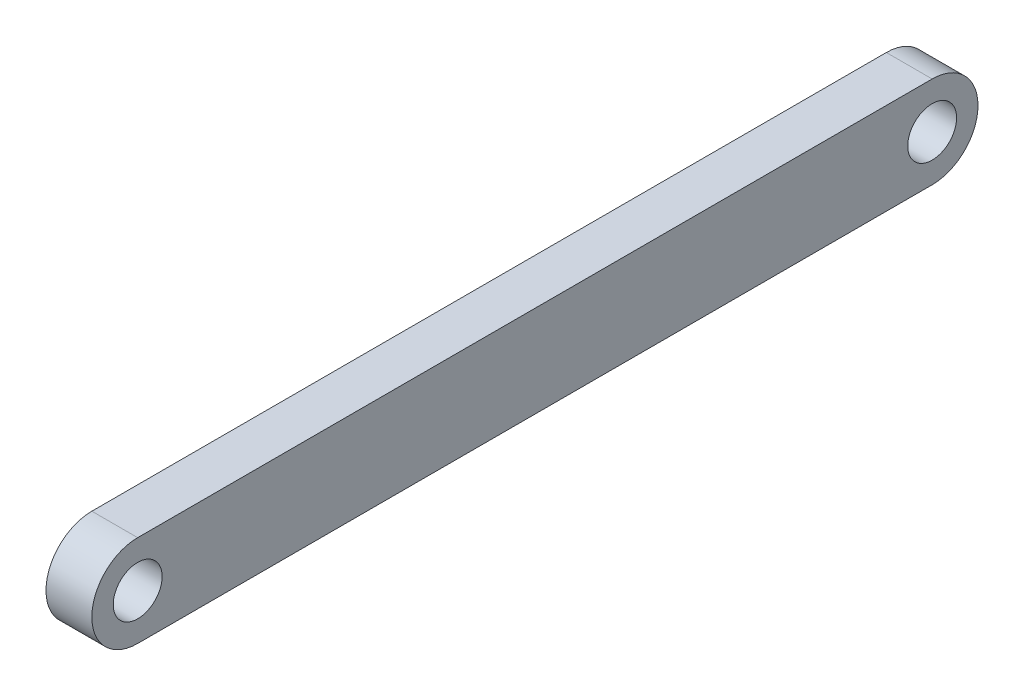
ISO-10303-21;
HEADER;
FILE_DESCRIPTION(('STEP AP214'),'2;1');
FILE_NAME('part.step','',(''),(''),'','','');
FILE_SCHEMA(('AUTOMOTIVE_DESIGN { 1 0 10303 214 1 1 1 1 }'));
ENDSEC;
DATA;
#1=APPLICATION_CONTEXT('core data for automotive mechanical design processes');
#2=APPLICATION_PROTOCOL_DEFINITION('international standard','automotive_design',2000,#1);
#3=PRODUCT_CONTEXT('',#1,'mechanical');
#4=PRODUCT('Part','Part','',(#3));
#5=PRODUCT_RELATED_PRODUCT_CATEGORY('part','',(#4));
#6=PRODUCT_DEFINITION_FORMATION('','',#4);
#7=PRODUCT_DEFINITION_CONTEXT('part definition',#1,'design');
#8=PRODUCT_DEFINITION('design','',#6,#7);
#9=PRODUCT_DEFINITION_SHAPE('','',#8);
#10=(LENGTH_UNIT() NAMED_UNIT(*) SI_UNIT(.MILLI.,.METRE.));
#11=(NAMED_UNIT(*) PLANE_ANGLE_UNIT() SI_UNIT($,.RADIAN.));
#12=(NAMED_UNIT(*) SI_UNIT($,.STERADIAN.) SOLID_ANGLE_UNIT());
#13=UNCERTAINTY_MEASURE_WITH_UNIT(LENGTH_MEASURE(1.E-05),#10,'distance_accuracy_value','');
#14=(GEOMETRIC_REPRESENTATION_CONTEXT(3) GLOBAL_UNCERTAINTY_ASSIGNED_CONTEXT((#13)) GLOBAL_UNIT_ASSIGNED_CONTEXT((#10,
#11,#12)) REPRESENTATION_CONTEXT('',''));
#15=CARTESIAN_POINT('',(0.,0.,0.));
#16=DIRECTION('',(0.,0.,1.));
#17=DIRECTION('',(1.,0.,0.));
#18=AXIS2_PLACEMENT_3D('',#15,#16,#17);
#19=CARTESIAN_POINT('',(3.,0.,52.));
#20=DIRECTION('',(1.,0.,0.));
#21=DIRECTION('',(0.,0.,-1.));
#22=AXIS2_PLACEMENT_3D('',#19,#20,#21);
#23=PLANE('',#22);
#24=CARTESIAN_POINT('',(3.,0.,52.));
#25=DIRECTION('',(1.,0.,0.));
#26=DIRECTION('',(0.,0.,-1.));
#27=AXIS2_PLACEMENT_3D('',#24,#25,#26);
#28=CIRCLE('',#27,1.6);
#29=CARTESIAN_POINT('',(3.,0.,50.4));
#30=VERTEX_POINT('',#29);
#31=EDGE_CURVE('E106',#30,#30,#28,.T.);
#32=ORIENTED_EDGE('',*,*,#31,.F.);
#33=EDGE_LOOP('',(#32));
#34=FACE_BOUND('',#33,.T.);
#35=CARTESIAN_POINT('',(3.,0.,52.));
#36=DIRECTION('',(1.,0.,0.));
#37=DIRECTION('',(0.,0.,-1.));
#38=AXIS2_PLACEMENT_3D('',#35,#36,#37);
#39=CIRCLE('',#38,3.);
#40=CARTESIAN_POINT('',(3.,3.,52.));
#41=VERTEX_POINT('',#40);
#42=CARTESIAN_POINT('',(3.,-3.,52.));
#43=VERTEX_POINT('',#42);
#44=EDGE_CURVE('E91',#41,#43,#39,.T.);
#45=ORIENTED_EDGE('',*,*,#44,.T.);
#46=DIRECTION('',(0.,0.,-1.));
#47=VECTOR('',#46,1.);
#48=CARTESIAN_POINT('',(3.,-3.,52.));
#49=LINE('',#48,#47);
#50=CARTESIAN_POINT('',(3.,-3.,0.));
#51=VERTEX_POINT('',#50);
#52=EDGE_CURVE('E86',#43,#51,#49,.T.);
#53=ORIENTED_EDGE('',*,*,#52,.T.);
#54=CARTESIAN_POINT('',(3.,0.,0.));
#55=DIRECTION('',(1.,0.,0.));
#56=DIRECTION('',(0.,0.,-1.));
#57=AXIS2_PLACEMENT_3D('',#54,#55,#56);
#58=CIRCLE('',#57,3.);
#59=CARTESIAN_POINT('',(3.,3.,0.));
#60=VERTEX_POINT('',#59);
#61=EDGE_CURVE('E89',#51,#60,#58,.T.);
#62=ORIENTED_EDGE('',*,*,#61,.T.);
#63=DIRECTION('',(0.,0.,1.));
#64=VECTOR('',#63,1.);
#65=CARTESIAN_POINT('',(3.,3.,52.));
#66=LINE('',#65,#64);
#67=EDGE_CURVE('E56',#60,#41,#66,.T.);
#68=ORIENTED_EDGE('',*,*,#67,.T.);
#69=EDGE_LOOP('',(#45,#53,#62,#68));
#70=FACE_BOUND('',#69,.T.);
#71=CARTESIAN_POINT('',(3.,0.,0.));
#72=DIRECTION('',(1.,0.,0.));
#73=DIRECTION('',(0.,0.,-1.));
#74=AXIS2_PLACEMENT_3D('',#71,#72,#73);
#75=CIRCLE('',#74,1.60000000000005);
#76=CARTESIAN_POINT('',(3.,0.,-1.60000000000005));
#77=VERTEX_POINT('',#76);
#78=EDGE_CURVE('E121',#77,#77,#75,.T.);
#79=ORIENTED_EDGE('',*,*,#78,.F.);
#80=EDGE_LOOP('',(#79));
#81=FACE_BOUND('',#80,.T.);
#82=ADVANCED_FACE('F39',(#34,#70,#81),#23,.T.);
#83=CARTESIAN_POINT('',(0.,0.,52.));
#84=DIRECTION('',(1.,0.,0.));
#85=DIRECTION('',(0.,0.,-1.));
#86=AXIS2_PLACEMENT_3D('',#83,#84,#85);
#87=PLANE('',#86);
#88=CARTESIAN_POINT('',(0.,0.,52.));
#89=DIRECTION('',(1.,0.,0.));
#90=DIRECTION('',(0.,0.,-1.));
#91=AXIS2_PLACEMENT_3D('',#88,#89,#90);
#92=CIRCLE('',#91,3.);
#93=CARTESIAN_POINT('',(0.,3.,52.));
#94=VERTEX_POINT('',#93);
#95=CARTESIAN_POINT('',(0.,-3.,52.));
#96=VERTEX_POINT('',#95);
#97=EDGE_CURVE('E103',#94,#96,#92,.T.);
#98=ORIENTED_EDGE('',*,*,#97,.F.);
#99=DIRECTION('',(0.,0.,1.));
#100=VECTOR('',#99,1.);
#101=CARTESIAN_POINT('',(0.,3.,52.));
#102=LINE('',#101,#100);
#103=CARTESIAN_POINT('',(0.,3.,0.));
#104=VERTEX_POINT('',#103);
#105=EDGE_CURVE('E79',#104,#94,#102,.T.);
#106=ORIENTED_EDGE('',*,*,#105,.F.);
#107=CARTESIAN_POINT('',(0.,0.,0.));
#108=DIRECTION('',(1.,0.,0.));
#109=DIRECTION('',(0.,0.,-1.));
#110=AXIS2_PLACEMENT_3D('',#107,#108,#109);
#111=CIRCLE('',#110,3.);
#112=CARTESIAN_POINT('',(0.,-3.,0.));
#113=VERTEX_POINT('',#112);
#114=EDGE_CURVE('E73',#113,#104,#111,.T.);
#115=ORIENTED_EDGE('',*,*,#114,.F.);
#116=DIRECTION('',(0.,0.,-1.));
#117=VECTOR('',#116,1.);
#118=CARTESIAN_POINT('',(0.,-3.,52.));
#119=LINE('',#118,#117);
#120=EDGE_CURVE('E95',#96,#113,#119,.T.);
#121=ORIENTED_EDGE('',*,*,#120,.F.);
#122=EDGE_LOOP('',(#98,#106,#115,#121));
#123=FACE_BOUND('',#122,.T.);
#124=CARTESIAN_POINT('',(0.,0.,52.));
#125=DIRECTION('',(1.,0.,0.));
#126=DIRECTION('',(0.,0.,-1.));
#127=AXIS2_PLACEMENT_3D('',#124,#125,#126);
#128=CIRCLE('',#127,1.6);
#129=CARTESIAN_POINT('',(0.,0.,50.4));
#130=VERTEX_POINT('',#129);
#131=EDGE_CURVE('E118',#130,#130,#128,.T.);
#132=ORIENTED_EDGE('',*,*,#131,.T.);
#133=EDGE_LOOP('',(#132));
#134=FACE_BOUND('',#133,.T.);
#135=CARTESIAN_POINT('',(0.,0.,0.));
#136=DIRECTION('',(1.,0.,0.));
#137=DIRECTION('',(0.,0.,-1.));
#138=AXIS2_PLACEMENT_3D('',#135,#136,#137);
#139=CIRCLE('',#138,1.60000000000005);
#140=CARTESIAN_POINT('',(0.,0.,-1.60000000000005));
#141=VERTEX_POINT('',#140);
#142=EDGE_CURVE('E124',#141,#141,#139,.T.);
#143=ORIENTED_EDGE('',*,*,#142,.T.);
#144=EDGE_LOOP('',(#143));
#145=FACE_BOUND('',#144,.T.);
#146=ADVANCED_FACE('F114',(#123,#134,#145),#87,.F.);
#147=CARTESIAN_POINT('',(3.,0.,52.));
#148=DIRECTION('',(-1.,0.,0.));
#149=DIRECTION('',(0.,0.,1.));
#150=AXIS2_PLACEMENT_3D('',#147,#148,#149);
#151=CYLINDRICAL_SURFACE('',#150,3.);
#152=ORIENTED_EDGE('',*,*,#97,.T.);
#153=DIRECTION('',(-1.,0.,0.));
#154=VECTOR('',#153,1.);
#155=CARTESIAN_POINT('',(3.,-3.,52.));
#156=LINE('',#155,#154);
#157=EDGE_CURVE('E11',#43,#96,#156,.T.);
#158=ORIENTED_EDGE('',*,*,#157,.F.);
#159=ORIENTED_EDGE('',*,*,#44,.F.);
#160=DIRECTION('',(-1.,0.,0.));
#161=VECTOR('',#160,1.);
#162=CARTESIAN_POINT('',(3.,3.,52.));
#163=LINE('',#162,#161);
#164=EDGE_CURVE('E99',#41,#94,#163,.T.);
#165=ORIENTED_EDGE('',*,*,#164,.T.);
#166=EDGE_LOOP('',(#152,#158,#159,#165));
#167=FACE_BOUND('',#166,.T.);
#168=ADVANCED_FACE('F41',(#167),#151,.T.);
#169=CARTESIAN_POINT('',(3.,-3.,52.));
#170=DIRECTION('',(0.,1.,0.));
#171=DIRECTION('',(0.,0.,1.));
#172=AXIS2_PLACEMENT_3D('',#169,#170,#171);
#173=PLANE('',#172);
#174=ORIENTED_EDGE('',*,*,#120,.T.);
#175=DIRECTION('',(-1.,0.,0.));
#176=VECTOR('',#175,1.);
#177=CARTESIAN_POINT('',(3.,-3.,0.));
#178=LINE('',#177,#176);
#179=EDGE_CURVE('E48',#51,#113,#178,.T.);
#180=ORIENTED_EDGE('',*,*,#179,.F.);
#181=ORIENTED_EDGE('',*,*,#52,.F.);
#182=ORIENTED_EDGE('',*,*,#157,.T.);
#183=EDGE_LOOP('',(#174,#180,#181,#182));
#184=FACE_BOUND('',#183,.T.);
#185=ADVANCED_FACE('F94',(#184),#173,.F.);
#186=CARTESIAN_POINT('',(3.,0.,0.));
#187=DIRECTION('',(-1.,0.,0.));
#188=DIRECTION('',(0.,0.,1.));
#189=AXIS2_PLACEMENT_3D('',#186,#187,#188);
#190=CYLINDRICAL_SURFACE('',#189,3.);
#191=ORIENTED_EDGE('',*,*,#114,.T.);
#192=DIRECTION('',(-1.,0.,0.));
#193=VECTOR('',#192,1.);
#194=CARTESIAN_POINT('',(3.,3.,0.));
#195=LINE('',#194,#193);
#196=EDGE_CURVE('E96',#60,#104,#195,.T.);
#197=ORIENTED_EDGE('',*,*,#196,.F.);
#198=ORIENTED_EDGE('',*,*,#61,.F.);
#199=ORIENTED_EDGE('',*,*,#179,.T.);
#200=EDGE_LOOP('',(#191,#197,#198,#199));
#201=FACE_BOUND('',#200,.T.);
#202=ADVANCED_FACE('F97',(#201),#190,.T.);
#203=CARTESIAN_POINT('',(3.,3.,52.));
#204=DIRECTION('',(0.,-1.,0.));
#205=DIRECTION('',(0.,0.,-1.));
#206=AXIS2_PLACEMENT_3D('',#203,#204,#205);
#207=PLANE('',#206);
#208=ORIENTED_EDGE('',*,*,#105,.T.);
#209=ORIENTED_EDGE('',*,*,#164,.F.);
#210=ORIENTED_EDGE('',*,*,#67,.F.);
#211=ORIENTED_EDGE('',*,*,#196,.T.);
#212=EDGE_LOOP('',(#208,#209,#210,#211));
#213=FACE_BOUND('',#212,.T.);
#214=ADVANCED_FACE('F111',(#213),#207,.F.);
#215=CARTESIAN_POINT('',(3.,0.,52.));
#216=DIRECTION('',(-1.,0.,0.));
#217=DIRECTION('',(0.,0.,1.));
#218=AXIS2_PLACEMENT_3D('',#215,#216,#217);
#219=CYLINDRICAL_SURFACE('',#218,1.6);
#220=ORIENTED_EDGE('',*,*,#31,.T.);
#221=EDGE_LOOP('',(#220));
#222=FACE_BOUND('',#221,.T.);
#223=ORIENTED_EDGE('',*,*,#131,.F.);
#224=EDGE_LOOP('',(#223));
#225=FACE_BOUND('',#224,.T.);
#226=ADVANCED_FACE('F141',(#222,#225),#219,.F.);
#227=CARTESIAN_POINT('',(3.,0.,0.));
#228=DIRECTION('',(-1.,0.,0.));
#229=DIRECTION('',(0.,0.,1.));
#230=AXIS2_PLACEMENT_3D('',#227,#228,#229);
#231=CYLINDRICAL_SURFACE('',#230,1.60000000000005);
#232=ORIENTED_EDGE('',*,*,#78,.T.);
#233=EDGE_LOOP('',(#232));
#234=FACE_BOUND('',#233,.T.);
#235=ORIENTED_EDGE('',*,*,#142,.F.);
#236=EDGE_LOOP('',(#235));
#237=FACE_BOUND('',#236,.T.);
#238=ADVANCED_FACE('F130',(#234,#237),#231,.F.);
#239=CLOSED_SHELL('',(#82,#146,#168,#185,#202,#214,#226,#238));
#240=MANIFOLD_SOLID_BREP('B2',#239);
#241=ADVANCED_BREP_SHAPE_REPRESENTATION('',(#18,#240),#14);
#242=SHAPE_DEFINITION_REPRESENTATION(#9,#241);
ENDSEC;
END-ISO-10303-21;
